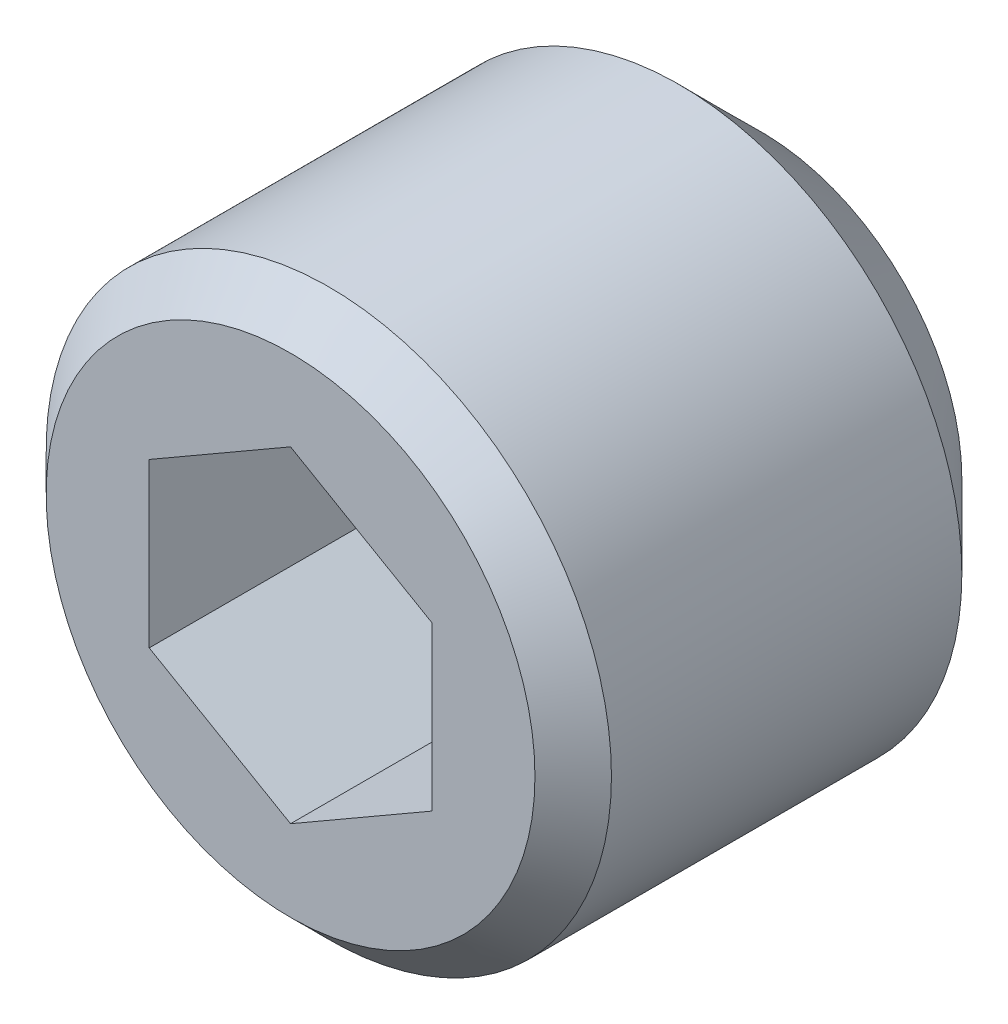
ISO-10303-21;
HEADER;
FILE_DESCRIPTION(('STEP AP214'),'2;1');
FILE_NAME('part.step','',(''),(''),'','','');
FILE_SCHEMA(('AUTOMOTIVE_DESIGN { 1 0 10303 214 1 1 1 1 }'));
ENDSEC;
DATA;
#1=APPLICATION_CONTEXT('core data for automotive mechanical design processes');
#2=APPLICATION_PROTOCOL_DEFINITION('international standard','automotive_design',2000,#1);
#3=PRODUCT_CONTEXT('',#1,'mechanical');
#4=PRODUCT('Part','Part','',(#3));
#5=PRODUCT_RELATED_PRODUCT_CATEGORY('part','',(#4));
#6=PRODUCT_DEFINITION_FORMATION('','',#4);
#7=PRODUCT_DEFINITION_CONTEXT('part definition',#1,'design');
#8=PRODUCT_DEFINITION('design','',#6,#7);
#9=PRODUCT_DEFINITION_SHAPE('','',#8);
#10=(LENGTH_UNIT() NAMED_UNIT(*) SI_UNIT(.MILLI.,.METRE.));
#11=(NAMED_UNIT(*) PLANE_ANGLE_UNIT() SI_UNIT($,.RADIAN.));
#12=(NAMED_UNIT(*) SI_UNIT($,.STERADIAN.) SOLID_ANGLE_UNIT());
#13=UNCERTAINTY_MEASURE_WITH_UNIT(LENGTH_MEASURE(1.E-05),#10,'distance_accuracy_value','');
#14=(GEOMETRIC_REPRESENTATION_CONTEXT(3) GLOBAL_UNCERTAINTY_ASSIGNED_CONTEXT((#13)) GLOBAL_UNIT_ASSIGNED_CONTEXT((#10,
#11,#12)) REPRESENTATION_CONTEXT('',''));
#15=CARTESIAN_POINT('',(0.,0.,0.));
#16=DIRECTION('',(0.,0.,1.));
#17=DIRECTION('',(1.,0.,0.));
#18=AXIS2_PLACEMENT_3D('',#15,#16,#17);
#19=CARTESIAN_POINT('',(0.,5.188125,0.));
#20=DIRECTION('',(0.,0.,-1.));
#21=DIRECTION('',(-1.,0.,0.));
#22=AXIS2_PLACEMENT_3D('',#19,#20,#21);
#23=PLANE('',#22);
#24=CARTESIAN_POINT('',(0.,0.,0.));
#25=DIRECTION('',(0.,0.,1.));
#26=DIRECTION('',(1.,0.,0.));
#27=AXIS2_PLACEMENT_3D('',#24,#25,#26);
#28=CIRCLE('',#27,5.188125);
#29=CARTESIAN_POINT('',(5.188125,0.,0.));
#30=VERTEX_POINT('',#29);
#31=EDGE_CURVE('E107',#30,#30,#28,.T.);
#32=ORIENTED_EDGE('',*,*,#31,.T.);
#33=EDGE_LOOP('',(#32));
#34=FACE_BOUND('',#33,.T.);
#35=DIRECTION('',(-0.866025403784438,-0.5,0.));
#36=VECTOR('',#35,1.);
#37=CARTESIAN_POINT('',(2.99999860124967,-1.73205,0.));
#38=LINE('',#37,#36);
#39=CARTESIAN_POINT('',(2.99999860124967,-1.73205,0.));
#40=VERTEX_POINT('',#39);
#41=CARTESIAN_POINT('',(0.,-3.4641,0.));
#42=VERTEX_POINT('',#41);
#43=EDGE_CURVE('E31',#40,#42,#38,.T.);
#44=ORIENTED_EDGE('',*,*,#43,.T.);
#45=DIRECTION('',(-0.866025403784439,0.5,0.));
#46=VECTOR('',#45,1.);
#47=CARTESIAN_POINT('',(0.,-3.4641,0.));
#48=LINE('',#47,#46);
#49=CARTESIAN_POINT('',(-2.99999860124967,-1.73205,0.));
#50=VERTEX_POINT('',#49);
#51=EDGE_CURVE('E153',#42,#50,#48,.T.);
#52=ORIENTED_EDGE('',*,*,#51,.T.);
#53=DIRECTION('',(0.,1.,0.));
#54=VECTOR('',#53,1.);
#55=CARTESIAN_POINT('',(-2.99999860124967,-1.73205,0.));
#56=LINE('',#55,#54);
#57=CARTESIAN_POINT('',(-2.99999860124967,1.73205,0.));
#58=VERTEX_POINT('',#57);
#59=EDGE_CURVE('E204',#50,#58,#56,.T.);
#60=ORIENTED_EDGE('',*,*,#59,.T.);
#61=DIRECTION('',(0.866025403784439,0.5,0.));
#62=VECTOR('',#61,1.);
#63=CARTESIAN_POINT('',(-2.99999860124967,1.73205,0.));
#64=LINE('',#63,#62);
#65=CARTESIAN_POINT('',(0.,3.4641,0.));
#66=VERTEX_POINT('',#65);
#67=EDGE_CURVE('E202',#58,#66,#64,.T.);
#68=ORIENTED_EDGE('',*,*,#67,.T.);
#69=DIRECTION('',(0.866025403784439,-0.5,0.));
#70=VECTOR('',#69,1.);
#71=CARTESIAN_POINT('',(0.,3.4641,0.));
#72=LINE('',#71,#70);
#73=CARTESIAN_POINT('',(2.99999860124967,1.73205,0.));
#74=VERTEX_POINT('',#73);
#75=EDGE_CURVE('E96',#66,#74,#72,.T.);
#76=ORIENTED_EDGE('',*,*,#75,.T.);
#77=DIRECTION('',(0.,-1.,0.));
#78=VECTOR('',#77,1.);
#79=CARTESIAN_POINT('',(2.99999860124967,1.73205,0.));
#80=LINE('',#79,#78);
#81=EDGE_CURVE('E92',#74,#40,#80,.T.);
#82=ORIENTED_EDGE('',*,*,#81,.T.);
#83=EDGE_LOOP('',(#44,#52,#60,#68,#76,#82));
#84=FACE_BOUND('',#83,.T.);
#85=ADVANCED_FACE('F17',(#34,#84),#23,.F.);
#86=CARTESIAN_POINT('',(0.,0.,-10.));
#87=DIRECTION('',(0.,0.,1.));
#88=DIRECTION('',(1.,0.,0.));
#89=AXIS2_PLACEMENT_3D('',#86,#87,#88);
#90=PLANE('',#89);
#91=CARTESIAN_POINT('',(0.,0.,-10.));
#92=DIRECTION('',(0.,0.,1.));
#93=DIRECTION('',(1.,0.,0.));
#94=AXIS2_PLACEMENT_3D('',#91,#92,#93);
#95=CIRCLE('',#94,4.25);
#96=CARTESIAN_POINT('',(4.25,0.,-10.));
#97=VERTEX_POINT('',#96);
#98=EDGE_CURVE('E11',#97,#97,#95,.T.);
#99=ORIENTED_EDGE('',*,*,#98,.F.);
#100=EDGE_LOOP('',(#99));
#101=FACE_BOUND('',#100,.T.);
#102=ADVANCED_FACE('F120',(#101),#90,.F.);
#103=CARTESIAN_POINT('',(0.,0.,-10.));
#104=DIRECTION('',(0.,0.,1.));
#105=DIRECTION('',(1.,0.,0.));
#106=AXIS2_PLACEMENT_3D('',#103,#104,#105);
#107=CONICAL_SURFACE('',#106,4.25,0.785398163397448);
#108=CARTESIAN_POINT('',(0.,0.,-8.25));
#109=DIRECTION('',(0.,0.,1.));
#110=DIRECTION('',(1.,0.,0.));
#111=AXIS2_PLACEMENT_3D('',#108,#109,#110);
#112=CIRCLE('',#111,6.);
#113=CARTESIAN_POINT('',(6.,0.,-8.25));
#114=VERTEX_POINT('',#113);
#115=EDGE_CURVE('E24',#114,#114,#112,.T.);
#116=ORIENTED_EDGE('',*,*,#115,.F.);
#117=EDGE_LOOP('',(#116));
#118=FACE_BOUND('',#117,.T.);
#119=ORIENTED_EDGE('',*,*,#98,.T.);
#120=EDGE_LOOP('',(#119));
#121=FACE_BOUND('',#120,.T.);
#122=ADVANCED_FACE('F117',(#118,#121),#107,.T.);
#123=CARTESIAN_POINT('',(0.,0.,0.));
#124=DIRECTION('',(0.,0.,1.));
#125=DIRECTION('',(1.,0.,0.));
#126=AXIS2_PLACEMENT_3D('',#123,#124,#125);
#127=CYLINDRICAL_SURFACE('',#126,6.);
#128=CARTESIAN_POINT('',(0.,0.,-0.811875));
#129=DIRECTION('',(0.,0.,1.));
#130=DIRECTION('',(1.,0.,0.));
#131=AXIS2_PLACEMENT_3D('',#128,#129,#130);
#132=CIRCLE('',#131,6.);
#133=CARTESIAN_POINT('',(6.,0.,-0.811875));
#134=VERTEX_POINT('',#133);
#135=EDGE_CURVE('E110',#134,#134,#132,.T.);
#136=ORIENTED_EDGE('',*,*,#135,.F.);
#137=EDGE_LOOP('',(#136));
#138=FACE_BOUND('',#137,.T.);
#139=ORIENTED_EDGE('',*,*,#115,.T.);
#140=EDGE_LOOP('',(#139));
#141=FACE_BOUND('',#140,.T.);
#142=ADVANCED_FACE('F115',(#138,#141),#127,.T.);
#143=CARTESIAN_POINT('',(0.,0.,-0.811875));
#144=DIRECTION('',(0.,0.,-1.));
#145=DIRECTION('',(-1.,0.,0.));
#146=AXIS2_PLACEMENT_3D('',#143,#144,#145);
#147=CONICAL_SURFACE('',#146,6.,0.785398163397448);
#148=ORIENTED_EDGE('',*,*,#31,.F.);
#149=EDGE_LOOP('',(#148));
#150=FACE_BOUND('',#149,.T.);
#151=ORIENTED_EDGE('',*,*,#135,.T.);
#152=EDGE_LOOP('',(#151));
#153=FACE_BOUND('',#152,.T.);
#154=ADVANCED_FACE('F133',(#150,#153),#147,.T.);
#155=CARTESIAN_POINT('',(2.99999860124967,-1.73205,-6.79999906749978));
#156=DIRECTION('',(-0.5,0.866025403784438,0.));
#157=DIRECTION('',(0.866025403784439,0.5,0.));
#158=AXIS2_PLACEMENT_3D('',#155,#156,#157);
#159=PLANE('',#158);
#160=DIRECTION('',(0.,0.,1.));
#161=VECTOR('',#160,1.);
#162=CARTESIAN_POINT('',(0.,-3.4641,-6.79999906749978));
#163=LINE('',#162,#161);
#164=CARTESIAN_POINT('',(0.,-3.4641,-4.8));
#165=VERTEX_POINT('',#164);
#166=EDGE_CURVE('E105',#165,#42,#163,.T.);
#167=ORIENTED_EDGE('',*,*,#166,.T.);
#168=ORIENTED_EDGE('',*,*,#43,.F.);
#169=DIRECTION('',(0.,0.,1.));
#170=VECTOR('',#169,1.);
#171=CARTESIAN_POINT('',(2.99999860124967,-1.73205,-6.79999906749978));
#172=LINE('',#171,#170);
#173=CARTESIAN_POINT('',(2.99999860124967,-1.73205,-4.8));
#174=VERTEX_POINT('',#173);
#175=EDGE_CURVE('E86',#174,#40,#172,.T.);
#176=ORIENTED_EDGE('',*,*,#175,.F.);
#177=CARTESIAN_POINT('',(-1.99999999281878E-07,-3.46410011547006,-4.79999993333333));
#178=CARTESIAN_POINT('',(0.131831573253017,-3.38798700569468,-4.84395660062426));
#179=CARTESIAN_POINT('',(0.264801316489847,-3.31121688864282,-4.88393288984113));
#180=CARTESIAN_POINT('',(0.533043085396849,-3.15634743115646,-4.95371030392869));
#181=CARTESIAN_POINT('',(0.668319875654691,-3.07824533988599,-4.98348674688629));
#182=CARTESIAN_POINT('',(0.937197038620187,-2.92300903746892,-5.02983592971495));
#183=CARTESIAN_POINT('',(1.070756052705,-2.84589870473434,-5.04671718500887));
#184=CARTESIAN_POINT('',(1.33850219269099,-2.69131539873895,-5.06686611668348));
#185=CARTESIAN_POINT('',(1.4726883460747,-2.61384298696135,-5.07015048211985));
#186=CARTESIAN_POINT('',(1.72340080489006,-2.46909408137511,-5.0633004501027));
#187=CARTESIAN_POINT('',(1.8399647316593,-2.40179586687708,-5.05484796255991));
#188=CARTESIAN_POINT('',(2.07233320919245,-2.26763786382214,-5.02806394878857));
#189=CARTESIAN_POINT('',(2.18813695685497,-2.20077853893602,-5.00972328213723));
#190=CARTESIAN_POINT('',(2.42098413584607,-2.06634415746546,-4.96387516277756));
#191=CARTESIAN_POINT('',(2.53799811206977,-1.99878610679375,-4.93617345345289));
#192=CARTESIAN_POINT('',(2.77028130525794,-1.86467734267834,-4.87330228360423));
#193=CARTESIAN_POINT('',(2.88555349574589,-1.79812491247004,-4.83814758583252));
#194=CARTESIAN_POINT('',(2.99999880124967,-1.73204988452995,-4.79999993333333));
#195=B_SPLINE_CURVE_WITH_KNOTS('',3,(#177,#178,#179,#180,#181,#182,#183,#184,#185,#186,#187,
#188,#189,#190,#191,#192,#193,#194),.UNSPECIFIED.,.F.,.F.,(4,2,2,2,2,2,2,2,4),(0.,
0.475523811434185,0.952190313638701,1.4170607948825,1.8813605166485,2.28556077099151,
2.69013530168782,3.10368135992586,3.51641580127465),.UNSPECIFIED.);
#196=EDGE_CURVE('E79',#165,#174,#195,.T.);
#197=ORIENTED_EDGE('',*,*,#196,.F.);
#198=EDGE_LOOP('',(#167,#168,#176,#197));
#199=FACE_BOUND('',#198,.T.);
#200=ADVANCED_FACE('F87',(#199),#159,.T.);
#201=CARTESIAN_POINT('',(0.,-3.4641,-6.79999906749978));
#202=DIRECTION('',(0.5,0.866025403784439,0.));
#203=DIRECTION('',(0.866025403784439,-0.5,0.));
#204=AXIS2_PLACEMENT_3D('',#201,#202,#203);
#205=PLANE('',#204);
#206=DIRECTION('',(0.,0.,1.));
#207=VECTOR('',#206,1.);
#208=CARTESIAN_POINT('',(-2.99999860124967,-1.73205,-6.79999906749978));
#209=LINE('',#208,#207);
#210=CARTESIAN_POINT('',(-2.99999860124967,-1.73205,-4.8));
#211=VERTEX_POINT('',#210);
#212=EDGE_CURVE('E103',#211,#50,#209,.T.);
#213=ORIENTED_EDGE('',*,*,#212,.T.);
#214=ORIENTED_EDGE('',*,*,#51,.F.);
#215=ORIENTED_EDGE('',*,*,#166,.F.);
#216=CARTESIAN_POINT('',(-2.99999880124967,-1.73204988452995,-4.79999993333333));
#217=CARTESIAN_POINT('',(-2.86816702799666,-1.80816299430532,-4.84395660062426));
#218=CARTESIAN_POINT('',(-2.73519728475983,-1.88493311135718,-4.88393288984113));
#219=CARTESIAN_POINT('',(-2.46695551585282,-2.03980256884354,-4.9537103039287));
#220=CARTESIAN_POINT('',(-2.33167872559498,-2.11790466011401,-4.98348674688629));
#221=CARTESIAN_POINT('',(-2.06280156262949,-2.27314096253109,-5.02983592971495));
#222=CARTESIAN_POINT('',(-1.92924254854467,-2.35025129526566,-5.04671718500887));
#223=CARTESIAN_POINT('',(-1.66149640855868,-2.50483460126105,-5.06686611668348));
#224=CARTESIAN_POINT('',(-1.52731025517497,-2.58230701303866,-5.07015048211985));
#225=CARTESIAN_POINT('',(-1.27659779635962,-2.7270559186249,-5.0633004501027));
#226=CARTESIAN_POINT('',(-1.16003386959037,-2.79435413312292,-5.05484796255991));
#227=CARTESIAN_POINT('',(-0.927665392057221,-2.92851213617786,-5.02806394878858));
#228=CARTESIAN_POINT('',(-0.811861644394705,-2.99537146106398,-5.00972328213724));
#229=CARTESIAN_POINT('',(-0.579014465403601,-3.12980584253454,-4.96387516277756));
#230=CARTESIAN_POINT('',(-0.462000489179899,-3.19736389320625,-4.93617345345289));
#231=CARTESIAN_POINT('',(-0.229717295991732,-3.33147265732166,-4.87330228360423));
#232=CARTESIAN_POINT('',(-0.11444510550378,-3.39802508752996,-4.83814758583252));
#233=CARTESIAN_POINT('',(2.00000001470796E-07,-3.46410011547006,-4.79999993333333));
#234=B_SPLINE_CURVE_WITH_KNOTS('',3,(#216,#217,#218,#219,#220,#221,#222,#223,#224,#225,#226,
#227,#228,#229,#230,#231,#232,#233),.UNSPECIFIED.,.F.,.F.,(4,2,2,2,2,2,2,2,4),(0.,
0.475523811434184,0.952190313638701,1.4170607948825,1.8813605166485,2.28556077099151,
2.69013530168782,3.10368135992586,3.51641580127465),.UNSPECIFIED.);
#235=EDGE_CURVE('E83',#211,#165,#234,.T.);
#236=ORIENTED_EDGE('',*,*,#235,.F.);
#237=EDGE_LOOP('',(#213,#214,#215,#236));
#238=FACE_BOUND('',#237,.T.);
#239=ADVANCED_FACE('F141',(#238),#205,.T.);
#240=CARTESIAN_POINT('',(-2.99999860124967,-1.73205,-6.79999906749978));
#241=DIRECTION('',(1.,0.,0.));
#242=DIRECTION('',(0.,-1.,0.));
#243=AXIS2_PLACEMENT_3D('',#240,#241,#242);
#244=PLANE('',#243);
#245=DIRECTION('',(0.,0.,1.));
#246=VECTOR('',#245,1.);
#247=CARTESIAN_POINT('',(-2.99999860124967,1.73205,-6.79999906749978));
#248=LINE('',#247,#246);
#249=CARTESIAN_POINT('',(-2.99999860124967,1.73205,-4.8));
#250=VERTEX_POINT('',#249);
#251=EDGE_CURVE('E101',#250,#58,#248,.T.);
#252=ORIENTED_EDGE('',*,*,#251,.T.);
#253=ORIENTED_EDGE('',*,*,#59,.F.);
#254=ORIENTED_EDGE('',*,*,#212,.F.);
#255=CARTESIAN_POINT('',(-2.99999860124967,-4.48543327457975,-3.68449465311211));
#256=CARTESIAN_POINT('',(-2.99999860124967,-4.35588300182655,-3.74664797176622));
#257=CARTESIAN_POINT('',(-2.99999860124967,-4.22601712691128,-3.80815571636333));
#258=CARTESIAN_POINT('',(-2.99999860124967,-3.96548596951946,-3.92951383206854));
#259=CARTESIAN_POINT('',(-2.99999860124967,-3.83482054830147,-3.98936390496307));
#260=CARTESIAN_POINT('',(-2.99999860124967,-3.57177288868179,-4.10737480982666));
#261=CARTESIAN_POINT('',(-2.99999860124967,-3.43938504407363,-4.16552319250757));
#262=CARTESIAN_POINT('',(-2.99999860124967,-3.17349843857587,-4.27921244077117));
#263=CARTESIAN_POINT('',(-2.99999860124967,-3.03999973583872,-4.33475344184958));
#264=CARTESIAN_POINT('',(-2.99999860124967,-2.76816246377821,-4.44394791174694));
#265=CARTESIAN_POINT('',(-2.99999860124967,-2.62978861216801,-4.49751406198046));
#266=CARTESIAN_POINT('',(-2.99999860124967,-2.35136718489165,-4.60019282287439));
#267=CARTESIAN_POINT('',(-2.99999860124967,-2.21131941736898,-4.64930491738277));
#268=CARTESIAN_POINT('',(-2.99999860124967,-1.92964461204658,-4.74167316371247));
#269=CARTESIAN_POINT('',(-2.99999860124968,-1.78802198154102,-4.78494261069782));
#270=CARTESIAN_POINT('',(-2.99999860124968,-1.50275951789172,-4.86413962638966));
#271=CARTESIAN_POINT('',(-2.99999860124967,-1.35912038013319,-4.90006966267813));
#272=CARTESIAN_POINT('',(-2.99999860124967,-1.07010555070939,-4.96267882072596));
#273=CARTESIAN_POINT('',(-2.99999860124968,-0.924733968225593,-4.98937654258433));
#274=CARTESIAN_POINT('',(-2.99999860124968,-0.632364406889403,-5.03177067036376));
#275=CARTESIAN_POINT('',(-2.99999860124968,-0.485366538626359,-5.04746781972242));
#276=CARTESIAN_POINT('',(-2.99999860124968,-0.192319587586963,-5.06640441427494));
#277=CARTESIAN_POINT('',(-2.99999860124968,-0.0462802395760674,-5.06979086878861));
#278=CARTESIAN_POINT('',(-2.99999860124968,0.245570179658276,-5.06419693200578));
#279=CARTESIAN_POINT('',(-2.99999860124967,0.391381236187204,-5.05521577495655));
#280=CARTESIAN_POINT('',(-2.99999860124967,0.643868801826986,-5.02956068070182));
#281=CARTESIAN_POINT('',(-2.99999860124968,0.750824417354773,-5.01550710614136));
#282=CARTESIAN_POINT('',(-2.99999860124968,0.963839823434601,-4.98171247654398));
#283=CARTESIAN_POINT('',(-2.99999860124968,1.06989946730708,-4.96197050814596));
#284=CARTESIAN_POINT('',(-2.99999860124968,1.38665231750934,-4.89526225273312));
#285=CARTESIAN_POINT('',(-2.99999860124968,1.59578448984873,-4.84082901995625));
#286=CARTESIAN_POINT('',(-2.99999860124968,1.90847464702713,-4.74784095611672));
#287=CARTESIAN_POINT('',(-2.99999860124968,2.01368123462014,-4.7145261164773));
#288=CARTESIAN_POINT('',(-2.99999860124968,2.22307127858394,-4.64479446700127));
#289=CARTESIAN_POINT('',(-2.99999860124968,2.32725472760427,-4.60837763489738));
#290=CARTESIAN_POINT('',(-2.99999860124968,2.53464013818453,-4.53299634419402));
#291=CARTESIAN_POINT('',(-2.99999860124968,2.63784247739575,-4.494032915424));
#292=CARTESIAN_POINT('',(-2.99999860124968,2.84341531634037,-4.41398079822274));
#293=CARTESIAN_POINT('',(-2.99999860124968,2.94578582976176,-4.37289214484512));
#294=CARTESIAN_POINT('',(-2.99999860124967,3.20709883754634,-4.26537514413791));
#295=CARTESIAN_POINT('',(-2.99999860124968,3.36551841802484,-4.19767752660152));
#296=CARTESIAN_POINT('',(-2.99999860124968,3.6809303246075,-4.05902554776769));
#297=CARTESIAN_POINT('',(-2.99999860124968,3.83792254310316,-3.98807094332623));
#298=CARTESIAN_POINT('',(-2.99999860124968,4.15078500062766,-3.84363990548606));
#299=CARTESIAN_POINT('',(-2.99999860124968,4.30665496243387,-3.77016287321123));
#300=CARTESIAN_POINT('',(-2.99999860124968,4.61745612885011,-3.62124644733996));
#301=CARTESIAN_POINT('',(-2.99999860124968,4.77238731248607,-3.54580701009755));
#302=CARTESIAN_POINT('',(-2.99999860124968,5.23640411474908,-3.31700074965763));
#303=CARTESIAN_POINT('',(-2.99999860124968,5.54434651368804,-3.16131769062067));
#304=CARTESIAN_POINT('',(-2.99999860124968,6.15811760365522,-2.84597269725409));
#305=CARTESIAN_POINT('',(-2.99999860124968,6.46394659175156,-2.68631133728222));
#306=CARTESIAN_POINT('',(-2.99999860124968,7.04534859603392,-2.37942486987801));
#307=CARTESIAN_POINT('',(-2.99999860124968,7.32105297221169,-2.23244822668796));
#308=CARTESIAN_POINT('',(-2.99999860124968,7.87157644618078,-1.93682079058922));
#309=CARTESIAN_POINT('',(-2.99999860124968,8.14639550578769,-1.78816992668113));
#310=CARTESIAN_POINT('',(-2.99999860124968,8.69465217200285,-1.48999288370559));
#311=CARTESIAN_POINT('',(-2.99999860124968,8.96809151442406,-1.3404698927271));
#312=CARTESIAN_POINT('',(-2.99999860124968,9.51441589107324,-1.0404515363367));
#313=CARTESIAN_POINT('',(-2.99999860124968,9.78730095639255,-0.889956227562885));
#314=CARTESIAN_POINT('',(-2.99999860124968,10.0599874240884,-0.739104233117742));
#315=B_SPLINE_CURVE_WITH_KNOTS('',3,(#255,#256,#257,#258,#259,#260,#261,#262,#263,#264,#265,
#266,#267,#268,#269,#270,#271,#272,#273,#274,#275,#276,#277,#278,#279,#280,#281,#282,#283,#284,
#285,#286,#287,#288,#289,#290,#291,#292,#293,#294,#295,#296,#297,#298,#299,#300,#301,#302,#303,
#304,#305,#306,#307,#308,#309,#310,#311,#312,#313,#314),.UNSPECIFIED.,.F.,.F.,(4,2,2,2,2,2,2,2,
2,2,2,2,2,2,2,2,2,2,2,2,2,2,2,2,2,2,2,2,2,4),(0.,0.431070825248604,0.862218702551864,
1.29598193860399,1.72972260861815,2.1748037353817,2.61993637402203,3.06403838354728,
3.50799083496352,3.95104358384142,4.39406638756485,4.83178108559761,5.26952288638149,
5.5929878573422,5.91650479466269,6.56394435562554,6.89498708798862,7.2260321969028,
7.5569442515706,7.88785084989217,8.40463217678595,8.92145214592822,9.43839567908051,
9.95535071944864,10.9904746590864,12.0254500112855,12.962744347787,13.9000785833291,
14.8350286839003,15.7699248054606),.UNSPECIFIED.);
#316=EDGE_CURVE('E178',#250,#211,#315,.F.);
#317=ORIENTED_EDGE('',*,*,#316,.F.);
#318=EDGE_LOOP('',(#252,#253,#254,#317));
#319=FACE_BOUND('',#318,.T.);
#320=ADVANCED_FACE('F182',(#319),#244,.T.);
#321=CARTESIAN_POINT('',(-2.99999860124967,1.73205,-6.79999906749978));
#322=DIRECTION('',(0.5,-0.866025403784439,0.));
#323=DIRECTION('',(-0.866025403784439,-0.5,0.));
#324=AXIS2_PLACEMENT_3D('',#321,#322,#323);
#325=PLANE('',#324);
#326=DIRECTION('',(0.,0.,1.));
#327=VECTOR('',#326,1.);
#328=CARTESIAN_POINT('',(0.,3.4641,-6.79999906749978));
#329=LINE('',#328,#327);
#330=CARTESIAN_POINT('',(0.,3.4641,-4.8));
#331=VERTEX_POINT('',#330);
#332=EDGE_CURVE('E94',#331,#66,#329,.T.);
#333=ORIENTED_EDGE('',*,*,#332,.T.);
#334=ORIENTED_EDGE('',*,*,#67,.F.);
#335=ORIENTED_EDGE('',*,*,#251,.F.);
#336=CARTESIAN_POINT('',(1.99999999841966E-07,3.46410011547006,-4.79999993333333));
#337=CARTESIAN_POINT('',(-0.131831573253016,3.38798700569468,-4.84395660062426));
#338=CARTESIAN_POINT('',(-0.264801316489845,3.31121688864282,-4.88393288984113));
#339=CARTESIAN_POINT('',(-0.533043085396847,3.15634743115646,-4.95371030392869));
#340=CARTESIAN_POINT('',(-0.668319875654688,3.07824533988599,-4.98348674688629));
#341=CARTESIAN_POINT('',(-0.937197038620184,2.92300903746892,-5.02983592971495));
#342=CARTESIAN_POINT('',(-1.070756052705,2.84589870473435,-5.04671718500887));
#343=CARTESIAN_POINT('',(-1.33850219269099,2.69131539873895,-5.06686611668348));
#344=CARTESIAN_POINT('',(-1.4726883460747,2.61384298696135,-5.07015048211985));
#345=CARTESIAN_POINT('',(-1.72340080489005,2.46909408137511,-5.0633004501027));
#346=CARTESIAN_POINT('',(-1.8399647316593,2.40179586687709,-5.05484796255991));
#347=CARTESIAN_POINT('',(-2.07233320919245,2.26763786382214,-5.02806394878858));
#348=CARTESIAN_POINT('',(-2.18813695685497,2.20077853893602,-5.00972328213724));
#349=CARTESIAN_POINT('',(-2.42098413584607,2.06634415746546,-4.96387516277756));
#350=CARTESIAN_POINT('',(-2.53799811206977,1.99878610679376,-4.93617345345289));
#351=CARTESIAN_POINT('',(-2.77028130525794,1.86467734267834,-4.87330228360423));
#352=CARTESIAN_POINT('',(-2.88555349574589,1.79812491247004,-4.83814758583252));
#353=CARTESIAN_POINT('',(-2.99999880124967,1.73204988452995,-4.79999993333333));
#354=B_SPLINE_CURVE_WITH_KNOTS('',3,(#336,#337,#338,#339,#340,#341,#342,#343,#344,#345,#346,
#347,#348,#349,#350,#351,#352,#353),.UNSPECIFIED.,.F.,.F.,(4,2,2,2,2,2,2,2,4),(0.,
0.475523811434183,0.952190313638698,1.4170607948825,1.8813605166485,2.2855607709915,
2.69013530168782,3.10368135992586,3.51641580127465),.UNSPECIFIED.);
#355=EDGE_CURVE('E173',#331,#250,#354,.T.);
#356=ORIENTED_EDGE('',*,*,#355,.F.);
#357=EDGE_LOOP('',(#333,#334,#335,#356));
#358=FACE_BOUND('',#357,.T.);
#359=ADVANCED_FACE('F185',(#358),#325,.T.);
#360=CARTESIAN_POINT('',(0.,3.4641,-6.79999906749978));
#361=DIRECTION('',(-0.5,-0.866025403784439,0.));
#362=DIRECTION('',(-0.866025403784439,0.5,0.));
#363=AXIS2_PLACEMENT_3D('',#360,#361,#362);
#364=PLANE('',#363);
#365=DIRECTION('',(0.,0.,1.));
#366=VECTOR('',#365,1.);
#367=CARTESIAN_POINT('',(2.99999860124967,1.73205,-6.79999906749978));
#368=LINE('',#367,#366);
#369=CARTESIAN_POINT('',(2.99999860124967,1.73205,-4.8));
#370=VERTEX_POINT('',#369);
#371=EDGE_CURVE('E91',#370,#74,#368,.T.);
#372=ORIENTED_EDGE('',*,*,#371,.T.);
#373=ORIENTED_EDGE('',*,*,#75,.F.);
#374=ORIENTED_EDGE('',*,*,#332,.F.);
#375=CARTESIAN_POINT('',(2.99999880124967,1.73204988452995,-4.79999993333333));
#376=CARTESIAN_POINT('',(2.86816702799666,1.80816299430532,-4.84395660062426));
#377=CARTESIAN_POINT('',(2.73519728475983,1.88493311135718,-4.88393288984113));
#378=CARTESIAN_POINT('',(2.46695551585282,2.03980256884354,-4.95371030392869));
#379=CARTESIAN_POINT('',(2.33167872559498,2.11790466011401,-4.98348674688629));
#380=CARTESIAN_POINT('',(2.06280156262949,2.27314096253109,-5.02983592971495));
#381=CARTESIAN_POINT('',(1.92924254854467,2.35025129526566,-5.04671718500887));
#382=CARTESIAN_POINT('',(1.66149640855868,2.50483460126105,-5.06686611668348));
#383=CARTESIAN_POINT('',(1.52731025517497,2.58230701303866,-5.07015048211985));
#384=CARTESIAN_POINT('',(1.27659779635962,2.72705591862489,-5.0633004501027));
#385=CARTESIAN_POINT('',(1.16003386959037,2.79435413312292,-5.05484796255991));
#386=CARTESIAN_POINT('',(0.927665392057222,2.92851213617786,-5.02806394878858));
#387=CARTESIAN_POINT('',(0.811861644394706,2.99537146106398,-5.00972328213724));
#388=CARTESIAN_POINT('',(0.579014465403602,3.12980584253454,-4.96387516277756));
#389=CARTESIAN_POINT('',(0.4620004891799,3.19736389320625,-4.93617345345289));
#390=CARTESIAN_POINT('',(0.229717295991734,3.33147265732166,-4.87330228360423));
#391=CARTESIAN_POINT('',(0.114445105503782,3.39802508752996,-4.83814758583252));
#392=CARTESIAN_POINT('',(-2.00000000160365E-07,3.46410011547006,-4.79999993333333));
#393=B_SPLINE_CURVE_WITH_KNOTS('',3,(#375,#376,#377,#378,#379,#380,#381,#382,#383,#384,#385,
#386,#387,#388,#389,#390,#391,#392),.UNSPECIFIED.,.F.,.F.,(4,2,2,2,2,2,2,2,4),(0.,
0.475523811434184,0.952190313638701,1.4170607948825,1.8813605166485,2.28556077099151,
2.69013530168782,3.10368135992586,3.51641580127464),.UNSPECIFIED.);
#394=EDGE_CURVE('E39',#370,#331,#393,.T.);
#395=ORIENTED_EDGE('',*,*,#394,.F.);
#396=EDGE_LOOP('',(#372,#373,#374,#395));
#397=FACE_BOUND('',#396,.T.);
#398=ADVANCED_FACE('F189',(#397),#364,.T.);
#399=CARTESIAN_POINT('',(2.99999860124967,1.73205,-6.79999906749978));
#400=DIRECTION('',(-1.,0.,0.));
#401=DIRECTION('',(0.,1.,0.));
#402=AXIS2_PLACEMENT_3D('',#399,#400,#401);
#403=PLANE('',#402);
#404=ORIENTED_EDGE('',*,*,#175,.T.);
#405=ORIENTED_EDGE('',*,*,#81,.F.);
#406=ORIENTED_EDGE('',*,*,#371,.F.);
#407=CARTESIAN_POINT('',(2.99999860124968,-4.48543327457975,-3.68449465311211));
#408=CARTESIAN_POINT('',(2.99999860124968,-4.35588300182654,-3.74664797176622));
#409=CARTESIAN_POINT('',(2.99999860124968,-4.22601712691128,-3.80815571636334));
#410=CARTESIAN_POINT('',(2.99999860124968,-3.96548596951946,-3.92951383206854));
#411=CARTESIAN_POINT('',(2.99999860124968,-3.83482054830146,-3.98936390496307));
#412=CARTESIAN_POINT('',(2.99999860124968,-3.57177288868178,-4.10737480982666));
#413=CARTESIAN_POINT('',(2.99999860124968,-3.43938504407363,-4.16552319250757));
#414=CARTESIAN_POINT('',(2.99999860124968,-3.17349843857586,-4.27921244077117));
#415=CARTESIAN_POINT('',(2.99999860124968,-3.03999973583871,-4.33475344184958));
#416=CARTESIAN_POINT('',(2.99999860124968,-2.76816246377821,-4.44394791174694));
#417=CARTESIAN_POINT('',(2.99999860124968,-2.62978861216801,-4.49751406198046));
#418=CARTESIAN_POINT('',(2.99999860124968,-2.35136718489165,-4.60019282287439));
#419=CARTESIAN_POINT('',(2.99999860124968,-2.21131941736897,-4.64930491738277));
#420=CARTESIAN_POINT('',(2.99999860124968,-1.92964461204658,-4.74167316371247));
#421=CARTESIAN_POINT('',(2.99999860124968,-1.78802198154102,-4.78494261069782));
#422=CARTESIAN_POINT('',(2.99999860124968,-1.50275951789171,-4.86413962638966));
#423=CARTESIAN_POINT('',(2.99999860124967,-1.35912038013319,-4.90006966267813));
#424=CARTESIAN_POINT('',(2.99999860124967,-1.07010555070939,-4.96267882072596));
#425=CARTESIAN_POINT('',(2.99999860124968,-0.924733968225588,-4.98937654258433));
#426=CARTESIAN_POINT('',(2.99999860124968,-0.632364406889398,-5.03177067036376));
#427=CARTESIAN_POINT('',(2.99999860124968,-0.485366538626354,-5.04746781972242));
#428=CARTESIAN_POINT('',(2.99999860124968,-0.192319587586959,-5.06640441427494));
#429=CARTESIAN_POINT('',(2.99999860124968,-0.0462802395760638,-5.06979086878861));
#430=CARTESIAN_POINT('',(2.99999860124968,0.24557017965828,-5.06419693200578));
#431=CARTESIAN_POINT('',(2.99999860124967,0.391381236187208,-5.05521577495655));
#432=CARTESIAN_POINT('',(2.99999860124967,0.64386880182699,-5.02956068070182));
#433=CARTESIAN_POINT('',(2.99999860124968,0.750824417354777,-5.01550710614136));
#434=CARTESIAN_POINT('',(2.99999860124968,0.963839823434605,-4.98171247654398));
#435=CARTESIAN_POINT('',(2.99999860124967,1.06989946730709,-4.96197050814596));
#436=CARTESIAN_POINT('',(2.99999860124967,1.38665231750935,-4.89526225273312));
#437=CARTESIAN_POINT('',(2.99999860124967,1.59578448984873,-4.84082901995625));
#438=CARTESIAN_POINT('',(2.99999860124967,1.90847464702714,-4.74784095611672));
#439=CARTESIAN_POINT('',(2.99999860124967,2.01368123462014,-4.7145261164773));
#440=CARTESIAN_POINT('',(2.99999860124967,2.22307127858395,-4.64479446700127));
#441=CARTESIAN_POINT('',(2.99999860124967,2.32725472760428,-4.60837763489738));
#442=CARTESIAN_POINT('',(2.99999860124967,2.53464013818454,-4.53299634419402));
#443=CARTESIAN_POINT('',(2.99999860124967,2.63784247739576,-4.494032915424));
#444=CARTESIAN_POINT('',(2.99999860124967,2.84341531634038,-4.41398079822274));
#445=CARTESIAN_POINT('',(2.99999860124967,2.94578582976176,-4.37289214484512));
#446=CARTESIAN_POINT('',(2.99999860124967,3.20709883754635,-4.26537514413791));
#447=CARTESIAN_POINT('',(2.99999860124967,3.36551841802485,-4.19767752660152));
#448=CARTESIAN_POINT('',(2.99999860124967,3.68093032460751,-4.05902554776769));
#449=CARTESIAN_POINT('',(2.99999860124967,3.83792254310316,-3.98807094332623));
#450=CARTESIAN_POINT('',(2.99999860124967,4.15078500062767,-3.84363990548606));
#451=CARTESIAN_POINT('',(2.99999860124967,4.30665496243387,-3.77016287321123));
#452=CARTESIAN_POINT('',(2.99999860124967,4.61745612885011,-3.62124644733996));
#453=CARTESIAN_POINT('',(2.99999860124967,4.77238731248607,-3.54580701009755));
#454=CARTESIAN_POINT('',(2.99999860124967,5.23640411474909,-3.31700074965763));
#455=CARTESIAN_POINT('',(2.99999860124967,5.54434651368805,-3.16131769062067));
#456=CARTESIAN_POINT('',(2.99999860124967,6.15811760365523,-2.84597269725409));
#457=CARTESIAN_POINT('',(2.99999860124967,6.46394659175157,-2.68631133728222));
#458=CARTESIAN_POINT('',(2.99999860124967,7.04534859603392,-2.37942486987801));
#459=CARTESIAN_POINT('',(2.99999860124967,7.32105297221169,-2.23244822668796));
#460=CARTESIAN_POINT('',(2.99999860124967,7.87157644618078,-1.93682079058922));
#461=CARTESIAN_POINT('',(2.99999860124967,8.1463955057877,-1.78816992668113));
#462=CARTESIAN_POINT('',(2.99999860124967,8.69465217200285,-1.48999288370559));
#463=CARTESIAN_POINT('',(2.99999860124967,8.96809151442406,-1.3404698927271));
#464=CARTESIAN_POINT('',(2.99999860124967,9.51441589107324,-1.0404515363367));
#465=CARTESIAN_POINT('',(2.99999860124967,9.78730095639255,-0.889956227562887));
#466=CARTESIAN_POINT('',(2.99999860124966,10.0599874240884,-0.739104233117743));
#467=B_SPLINE_CURVE_WITH_KNOTS('',3,(#407,#408,#409,#410,#411,#412,#413,#414,#415,#416,#417,
#418,#419,#420,#421,#422,#423,#424,#425,#426,#427,#428,#429,#430,#431,#432,#433,#434,#435,#436,
#437,#438,#439,#440,#441,#442,#443,#444,#445,#446,#447,#448,#449,#450,#451,#452,#453,#454,#455,
#456,#457,#458,#459,#460,#461,#462,#463,#464,#465,#466),.UNSPECIFIED.,.F.,.F.,(4,2,2,2,2,2,2,2,
2,2,2,2,2,2,2,2,2,2,2,2,2,2,2,2,2,2,2,2,2,4),(0.,0.431070825248604,0.862218702551866,
1.29598193860399,1.72972260861815,2.1748037353817,2.61993637402203,3.06403838354728,
3.50799083496352,3.95104358384142,4.39406638756485,4.83178108559761,5.26952288638149,
5.5929878573422,5.91650479466269,6.56394435562554,6.89498708798862,7.2260321969028,
7.5569442515706,7.88785084989216,8.40463217678595,8.92145214592822,9.43839567908051,
9.95535071944864,10.9904746590864,12.0254500112855,12.962744347787,13.9000785833291,
14.8350286839003,15.7699248054605),.UNSPECIFIED.);
#468=EDGE_CURVE('E80',#174,#370,#467,.T.);
#469=ORIENTED_EDGE('',*,*,#468,.F.);
#470=EDGE_LOOP('',(#404,#405,#406,#469));
#471=FACE_BOUND('',#470,.T.);
#472=ADVANCED_FACE('F75',(#471),#403,.T.);
#473=CARTESIAN_POINT('',(0.,0.,-6.79999906749978));
#474=DIRECTION('',(0.,0.,1.));
#475=DIRECTION('',(1.,0.,0.));
#476=AXIS2_PLACEMENT_3D('',#473,#474,#475);
#477=CONICAL_SURFACE('',#476,0.,1.0471975511966);
#478=CARTESIAN_POINT('',(0.,0.,-6.79999906749978));
#479=VERTEX_POINT('',#478);
#480=VERTEX_LOOP('',#479);
#481=FACE_BOUND('',#480,.T.);
#482=ORIENTED_EDGE('',*,*,#196,.T.);
#483=ORIENTED_EDGE('',*,*,#468,.T.);
#484=ORIENTED_EDGE('',*,*,#394,.T.);
#485=ORIENTED_EDGE('',*,*,#355,.T.);
#486=ORIENTED_EDGE('',*,*,#316,.T.);
#487=ORIENTED_EDGE('',*,*,#235,.T.);
#488=EDGE_LOOP('',(#482,#483,#484,#485,#486,#487));
#489=FACE_BOUND('',#488,.T.);
#490=ADVANCED_FACE('F72',(#481,#489),#477,.F.);
#491=CLOSED_SHELL('',(#85,#102,#122,#142,#154,#200,#239,#320,#359,#398,#472,#490));
#492=MANIFOLD_SOLID_BREP('B1',#491);
#493=ADVANCED_BREP_SHAPE_REPRESENTATION('',(#18,#492),#14);
#494=SHAPE_DEFINITION_REPRESENTATION(#9,#493);
ENDSEC;
END-ISO-10303-21;
